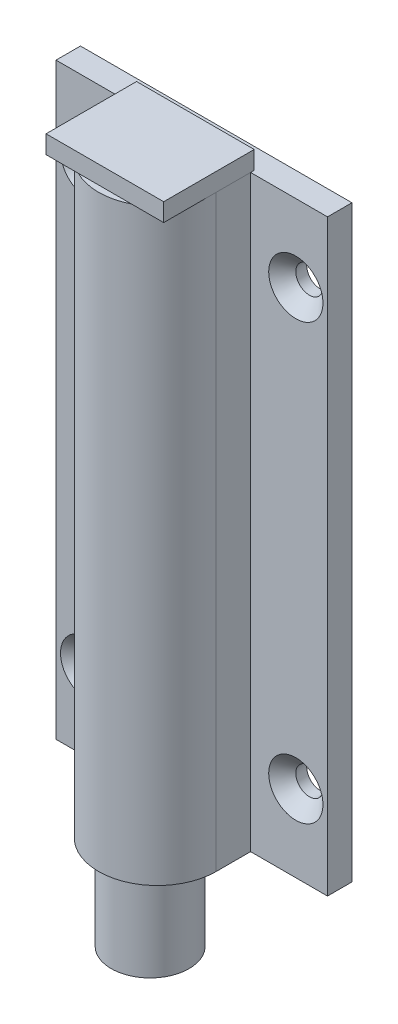
ISO-10303-21;
HEADER;
FILE_DESCRIPTION(('STEP AP214'),'2;1');
FILE_NAME('part.step','',(''),(''),'','','');
FILE_SCHEMA(('AUTOMOTIVE_DESIGN { 1 0 10303 214 1 1 1 1 }'));
ENDSEC;
DATA;
#1=APPLICATION_CONTEXT('core data for automotive mechanical design processes');
#2=APPLICATION_PROTOCOL_DEFINITION('international standard','automotive_design',2000,#1);
#3=PRODUCT_CONTEXT('',#1,'mechanical');
#4=PRODUCT('Part','Part','',(#3));
#5=PRODUCT_RELATED_PRODUCT_CATEGORY('part','',(#4));
#6=PRODUCT_DEFINITION_FORMATION('','',#4);
#7=PRODUCT_DEFINITION_CONTEXT('part definition',#1,'design');
#8=PRODUCT_DEFINITION('design','',#6,#7);
#9=PRODUCT_DEFINITION_SHAPE('','',#8);
#10=(LENGTH_UNIT() NAMED_UNIT(*) SI_UNIT(.MILLI.,.METRE.));
#11=(NAMED_UNIT(*) PLANE_ANGLE_UNIT() SI_UNIT($,.RADIAN.));
#12=(NAMED_UNIT(*) SI_UNIT($,.STERADIAN.) SOLID_ANGLE_UNIT());
#13=UNCERTAINTY_MEASURE_WITH_UNIT(LENGTH_MEASURE(1.E-05),#10,'distance_accuracy_value','');
#14=(GEOMETRIC_REPRESENTATION_CONTEXT(3) GLOBAL_UNCERTAINTY_ASSIGNED_CONTEXT((#13)) GLOBAL_UNIT_ASSIGNED_CONTEXT((#10,
#11,#12)) REPRESENTATION_CONTEXT('',''));
#15=CARTESIAN_POINT('',(0.,0.,0.));
#16=DIRECTION('',(0.,0.,1.));
#17=DIRECTION('',(1.,0.,0.));
#18=AXIS2_PLACEMENT_3D('',#15,#16,#17);
#19=CARTESIAN_POINT('',(6.5,34.5,12.3));
#20=DIRECTION('',(-1.,0.,0.));
#21=DIRECTION('',(0.,0.,1.));
#22=AXIS2_PLACEMENT_3D('',#19,#20,#21);
#23=PLANE('',#22);
#24=DIRECTION('',(0.,0.,-1.));
#25=VECTOR('',#24,1.);
#26=CARTESIAN_POINT('',(6.5,32.5,12.3));
#27=LINE('',#26,#25);
#28=CARTESIAN_POINT('',(6.5,32.5,12.3));
#29=VERTEX_POINT('',#28);
#30=CARTESIAN_POINT('',(6.5,32.5,2.3));
#31=VERTEX_POINT('',#30);
#32=EDGE_CURVE('E115',#29,#31,#27,.T.);
#33=ORIENTED_EDGE('',*,*,#32,.T.);
#34=DIRECTION('',(0.,-1.,0.));
#35=VECTOR('',#34,1.);
#36=CARTESIAN_POINT('',(6.5,34.5,2.3));
#37=LINE('',#36,#35);
#38=CARTESIAN_POINT('',(6.5,34.5,2.3));
#39=VERTEX_POINT('',#38);
#40=EDGE_CURVE('E12',#39,#31,#37,.T.);
#41=ORIENTED_EDGE('',*,*,#40,.F.);
#42=DIRECTION('',(0.,0.,-1.));
#43=VECTOR('',#42,1.);
#44=CARTESIAN_POINT('',(6.5,34.5,12.3));
#45=LINE('',#44,#43);
#46=CARTESIAN_POINT('',(6.5,34.5,12.3));
#47=VERTEX_POINT('',#46);
#48=EDGE_CURVE('E103',#47,#39,#45,.T.);
#49=ORIENTED_EDGE('',*,*,#48,.F.);
#50=DIRECTION('',(0.,-1.,0.));
#51=VECTOR('',#50,1.);
#52=CARTESIAN_POINT('',(6.5,34.5,12.3));
#53=LINE('',#52,#51);
#54=EDGE_CURVE('E111',#47,#29,#53,.T.);
#55=ORIENTED_EDGE('',*,*,#54,.T.);
#56=EDGE_LOOP('',(#33,#41,#49,#55));
#57=FACE_BOUND('',#56,.T.);
#58=ADVANCED_FACE('F52',(#57),#23,.F.);
#59=CARTESIAN_POINT('',(-6.5,34.5,2.3));
#60=DIRECTION('',(0.,0.,1.));
#61=DIRECTION('',(1.,0.,0.));
#62=AXIS2_PLACEMENT_3D('',#59,#60,#61);
#63=PLANE('',#62);
#64=DIRECTION('',(-1.,0.,0.));
#65=VECTOR('',#64,1.);
#66=CARTESIAN_POINT('',(-6.5,32.5,2.3));
#67=LINE('',#66,#65);
#68=CARTESIAN_POINT('',(-6.5,32.5,2.3));
#69=VERTEX_POINT('',#68);
#70=EDGE_CURVE('E107',#31,#69,#67,.T.);
#71=ORIENTED_EDGE('',*,*,#70,.T.);
#72=DIRECTION('',(0.,-1.,0.));
#73=VECTOR('',#72,1.);
#74=CARTESIAN_POINT('',(-6.5,34.5,2.3));
#75=LINE('',#74,#73);
#76=CARTESIAN_POINT('',(-6.5,34.5,2.3));
#77=VERTEX_POINT('',#76);
#78=EDGE_CURVE('E60',#77,#69,#75,.T.);
#79=ORIENTED_EDGE('',*,*,#78,.F.);
#80=DIRECTION('',(-1.,0.,0.));
#81=VECTOR('',#80,1.);
#82=CARTESIAN_POINT('',(-6.5,34.5,2.3));
#83=LINE('',#82,#81);
#84=EDGE_CURVE('E98',#39,#77,#83,.T.);
#85=ORIENTED_EDGE('',*,*,#84,.F.);
#86=ORIENTED_EDGE('',*,*,#40,.T.);
#87=EDGE_LOOP('',(#71,#79,#85,#86));
#88=FACE_BOUND('',#87,.T.);
#89=ADVANCED_FACE('F106',(#88),#63,.F.);
#90=CARTESIAN_POINT('',(-6.5,34.5,12.3));
#91=DIRECTION('',(1.,0.,0.));
#92=DIRECTION('',(0.,0.,-1.));
#93=AXIS2_PLACEMENT_3D('',#90,#91,#92);
#94=PLANE('',#93);
#95=DIRECTION('',(0.,0.,1.));
#96=VECTOR('',#95,1.);
#97=CARTESIAN_POINT('',(-6.5,32.5,12.3));
#98=LINE('',#97,#96);
#99=CARTESIAN_POINT('',(-6.5,32.5,12.3));
#100=VERTEX_POINT('',#99);
#101=EDGE_CURVE('E85',#69,#100,#98,.T.);
#102=ORIENTED_EDGE('',*,*,#101,.T.);
#103=DIRECTION('',(0.,-1.,0.));
#104=VECTOR('',#103,1.);
#105=CARTESIAN_POINT('',(-6.5,34.5,12.3));
#106=LINE('',#105,#104);
#107=CARTESIAN_POINT('',(-6.5,34.5,12.3));
#108=VERTEX_POINT('',#107);
#109=EDGE_CURVE('E108',#108,#100,#106,.T.);
#110=ORIENTED_EDGE('',*,*,#109,.F.);
#111=DIRECTION('',(0.,0.,1.));
#112=VECTOR('',#111,1.);
#113=CARTESIAN_POINT('',(-6.5,34.5,12.3));
#114=LINE('',#113,#112);
#115=EDGE_CURVE('E101',#77,#108,#114,.T.);
#116=ORIENTED_EDGE('',*,*,#115,.F.);
#117=ORIENTED_EDGE('',*,*,#78,.T.);
#118=EDGE_LOOP('',(#102,#110,#116,#117));
#119=FACE_BOUND('',#118,.T.);
#120=ADVANCED_FACE('F109',(#119),#94,.F.);
#121=CARTESIAN_POINT('',(-6.5,34.5,12.3));
#122=DIRECTION('',(0.,0.,-1.));
#123=DIRECTION('',(-1.,0.,0.));
#124=AXIS2_PLACEMENT_3D('',#121,#122,#123);
#125=PLANE('',#124);
#126=DIRECTION('',(1.,0.,0.));
#127=VECTOR('',#126,1.);
#128=CARTESIAN_POINT('',(-6.5,32.5,12.3));
#129=LINE('',#128,#127);
#130=EDGE_CURVE('E91',#100,#29,#129,.T.);
#131=ORIENTED_EDGE('',*,*,#130,.T.);
#132=ORIENTED_EDGE('',*,*,#54,.F.);
#133=DIRECTION('',(1.,0.,0.));
#134=VECTOR('',#133,1.);
#135=CARTESIAN_POINT('',(-6.5,34.5,12.3));
#136=LINE('',#135,#134);
#137=EDGE_CURVE('E68',#108,#47,#136,.T.);
#138=ORIENTED_EDGE('',*,*,#137,.F.);
#139=ORIENTED_EDGE('',*,*,#109,.T.);
#140=EDGE_LOOP('',(#131,#132,#138,#139));
#141=FACE_BOUND('',#140,.T.);
#142=ADVANCED_FACE('F122',(#141),#125,.F.);
#143=CARTESIAN_POINT('',(0.,34.5,0.));
#144=DIRECTION('',(0.,-1.,0.));
#145=DIRECTION('',(0.,0.,-1.));
#146=AXIS2_PLACEMENT_3D('',#143,#144,#145);
#147=PLANE('',#146);
#148=ORIENTED_EDGE('',*,*,#48,.T.);
#149=ORIENTED_EDGE('',*,*,#84,.T.);
#150=ORIENTED_EDGE('',*,*,#115,.T.);
#151=ORIENTED_EDGE('',*,*,#137,.T.);
#152=EDGE_LOOP('',(#148,#149,#150,#151));
#153=FACE_BOUND('',#152,.T.);
#154=ADVANCED_FACE('F99',(#153),#147,.F.);
#155=CARTESIAN_POINT('',(0.,32.5,0.));
#156=DIRECTION('',(0.,-1.,0.));
#157=DIRECTION('',(0.,0.,-1.));
#158=AXIS2_PLACEMENT_3D('',#155,#156,#157);
#159=PLANE('',#158);
#160=ORIENTED_EDGE('',*,*,#32,.F.);
#161=ORIENTED_EDGE('',*,*,#130,.F.);
#162=ORIENTED_EDGE('',*,*,#101,.F.);
#163=ORIENTED_EDGE('',*,*,#70,.F.);
#164=EDGE_LOOP('',(#160,#161,#162,#163));
#165=FACE_BOUND('',#164,.T.);
#166=ADVANCED_FACE('F125',(#165),#159,.T.);
#167=CLOSED_SHELL('',(#58,#89,#120,#142,#154,#166));
#168=MANIFOLD_SOLID_BREP('B2',#167);
#169=CARTESIAN_POINT('',(0.,-42.5,7.3));
#170=DIRECTION('',(0.,1.,0.));
#171=DIRECTION('',(0.,0.,1.));
#172=AXIS2_PLACEMENT_3D('',#169,#170,#171);
#173=CYLINDRICAL_SURFACE('',#172,4.3);
#174=CARTESIAN_POINT('',(0.,-42.5,7.3));
#175=DIRECTION('',(0.,-1.,0.));
#176=DIRECTION('',(0.,0.,-1.));
#177=AXIS2_PLACEMENT_3D('',#174,#175,#176);
#178=CIRCLE('',#177,4.3);
#179=CARTESIAN_POINT('',(0.,-42.5,3.));
#180=VERTEX_POINT('',#179);
#181=EDGE_CURVE('E51',#180,#180,#178,.T.);
#182=ORIENTED_EDGE('',*,*,#181,.F.);
#183=EDGE_LOOP('',(#182));
#184=FACE_BOUND('',#183,.T.);
#185=CARTESIAN_POINT('',(0.,-32.5,7.3));
#186=DIRECTION('',(0.,-1.,0.));
#187=DIRECTION('',(0.,0.,-1.));
#188=AXIS2_PLACEMENT_3D('',#185,#186,#187);
#189=CIRCLE('',#188,4.3);
#190=CARTESIAN_POINT('',(0.,-32.5,3.));
#191=VERTEX_POINT('',#190);
#192=EDGE_CURVE('E188',#191,#191,#189,.T.);
#193=ORIENTED_EDGE('',*,*,#192,.T.);
#194=EDGE_LOOP('',(#193));
#195=FACE_BOUND('',#194,.T.);
#196=ADVANCED_FACE('F185',(#184,#195),#173,.T.);
#197=CARTESIAN_POINT('',(0.,-42.5,7.3));
#198=DIRECTION('',(0.,-1.,0.));
#199=DIRECTION('',(0.,0.,-1.));
#200=AXIS2_PLACEMENT_3D('',#197,#198,#199);
#201=PLANE('',#200);
#202=ORIENTED_EDGE('',*,*,#181,.T.);
#203=EDGE_LOOP('',(#202));
#204=FACE_BOUND('',#203,.T.);
#205=ADVANCED_FACE('F200',(#204),#201,.T.);
#206=CARTESIAN_POINT('',(0.,-32.5,7.3));
#207=DIRECTION('',(0.,-1.,0.));
#208=DIRECTION('',(0.,0.,-1.));
#209=AXIS2_PLACEMENT_3D('',#206,#207,#208);
#210=PLANE('',#209);
#211=ORIENTED_EDGE('',*,*,#192,.F.);
#212=EDGE_LOOP('',(#211));
#213=FACE_BOUND('',#212,.T.);
#214=ADVANCED_FACE('F198',(#213),#210,.F.);
#215=CLOSED_SHELL('',(#196,#205,#214));
#216=MANIFOLD_SOLID_BREP('B6',#215);
#217=CARTESIAN_POINT('',(0.,0.,2.7));
#218=DIRECTION('',(0.,0.,-1.));
#219=DIRECTION('',(-1.,0.,0.));
#220=AXIS2_PLACEMENT_3D('',#217,#218,#219);
#221=PLANE('',#220);
#222=CARTESIAN_POINT('',(-11.5,24.,2.7));
#223=DIRECTION('',(0.,0.,-1.));
#224=DIRECTION('',(-1.,0.,0.));
#225=AXIS2_PLACEMENT_3D('',#222,#223,#224);
#226=CIRCLE('',#225,3.00000000000004);
#227=CARTESIAN_POINT('',(-14.5,24.,2.7));
#228=VERTEX_POINT('',#227);
#229=EDGE_CURVE('E420',#228,#228,#226,.T.);
#230=ORIENTED_EDGE('',*,*,#229,.T.);
#231=EDGE_LOOP('',(#230));
#232=FACE_BOUND('',#231,.T.);
#233=CARTESIAN_POINT('',(-11.5,-24.,2.7));
#234=DIRECTION('',(0.,0.,-1.));
#235=DIRECTION('',(-1.,0.,0.));
#236=AXIS2_PLACEMENT_3D('',#233,#234,#235);
#237=CIRCLE('',#236,3.00000000000004);
#238=CARTESIAN_POINT('',(-14.5,-24.,2.7));
#239=VERTEX_POINT('',#238);
#240=EDGE_CURVE('E416',#239,#239,#237,.T.);
#241=ORIENTED_EDGE('',*,*,#240,.T.);
#242=EDGE_LOOP('',(#241));
#243=FACE_BOUND('',#242,.T.);
#244=DIRECTION('',(0.,-1.,0.));
#245=VECTOR('',#244,1.);
#246=CARTESIAN_POINT('',(-6.5,49.0858373318925,2.7));
#247=LINE('',#246,#245);
#248=CARTESIAN_POINT('',(-6.5,32.5,2.7));
#249=VERTEX_POINT('',#248);
#250=CARTESIAN_POINT('',(-6.5,-32.5,2.7));
#251=VERTEX_POINT('',#250);
#252=EDGE_CURVE('E251',#249,#251,#247,.T.);
#253=ORIENTED_EDGE('',*,*,#252,.F.);
#254=DIRECTION('',(-1.,0.,0.));
#255=VECTOR('',#254,1.);
#256=CARTESIAN_POINT('',(-15.,32.5,2.7));
#257=LINE('',#256,#255);
#258=CARTESIAN_POINT('',(-15.,32.5,2.7));
#259=VERTEX_POINT('',#258);
#260=EDGE_CURVE('E362',#249,#259,#257,.T.);
#261=ORIENTED_EDGE('',*,*,#260,.T.);
#262=DIRECTION('',(0.,-1.,0.));
#263=VECTOR('',#262,1.);
#264=CARTESIAN_POINT('',(-15.,-32.5,2.7));
#265=LINE('',#264,#263);
#266=CARTESIAN_POINT('',(-15.,-32.5,2.7));
#267=VERTEX_POINT('',#266);
#268=EDGE_CURVE('E367',#259,#267,#265,.T.);
#269=ORIENTED_EDGE('',*,*,#268,.T.);
#270=DIRECTION('',(1.,0.,0.));
#271=VECTOR('',#270,1.);
#272=CARTESIAN_POINT('',(-15.,-32.5,2.7));
#273=LINE('',#272,#271);
#274=EDGE_CURVE('E370',#267,#251,#273,.T.);
#275=ORIENTED_EDGE('',*,*,#274,.T.);
#276=EDGE_LOOP('',(#253,#261,#269,#275));
#277=FACE_BOUND('',#276,.T.);
#278=ADVANCED_FACE('F226',(#232,#243,#277),#221,.F.);
#279=CARTESIAN_POINT('',(11.5,24.,2.7));
#280=DIRECTION('',(0.,0.,-1.));
#281=DIRECTION('',(-1.,0.,0.));
#282=AXIS2_PLACEMENT_3D('',#279,#280,#281);
#283=CIRCLE('',#282,3.00000000000002);
#284=CARTESIAN_POINT('',(8.49999999999998,24.,2.7));
#285=VERTEX_POINT('',#284);
#286=EDGE_CURVE('E408',#285,#285,#283,.T.);
#287=ORIENTED_EDGE('',*,*,#286,.T.);
#288=EDGE_LOOP('',(#287));
#289=FACE_BOUND('',#288,.T.);
#290=CARTESIAN_POINT('',(11.5,-24.,2.7));
#291=DIRECTION('',(0.,0.,-1.));
#292=DIRECTION('',(-1.,0.,0.));
#293=AXIS2_PLACEMENT_3D('',#290,#291,#292);
#294=CIRCLE('',#293,3.00000000000002);
#295=CARTESIAN_POINT('',(8.49999999999998,-24.,2.7));
#296=VERTEX_POINT('',#295);
#297=EDGE_CURVE('E404',#296,#296,#294,.T.);
#298=ORIENTED_EDGE('',*,*,#297,.T.);
#299=EDGE_LOOP('',(#298));
#300=FACE_BOUND('',#299,.T.);
#301=CARTESIAN_POINT('',(15.,32.5,2.7));
#302=VERTEX_POINT('',#301);
#303=CARTESIAN_POINT('',(6.5,32.5,2.7));
#304=VERTEX_POINT('',#303);
#305=EDGE_CURVE('E364',#302,#304,#257,.T.);
#306=ORIENTED_EDGE('',*,*,#305,.T.);
#307=DIRECTION('',(0.,-1.,0.));
#308=VECTOR('',#307,1.);
#309=CARTESIAN_POINT('',(6.5,49.0858373318925,2.7));
#310=LINE('',#309,#308);
#311=CARTESIAN_POINT('',(6.5,-32.5,2.7));
#312=VERTEX_POINT('',#311);
#313=EDGE_CURVE('E243',#304,#312,#310,.T.);
#314=ORIENTED_EDGE('',*,*,#313,.T.);
#315=CARTESIAN_POINT('',(15.,-32.5,2.7));
#316=VERTEX_POINT('',#315);
#317=EDGE_CURVE('E319',#312,#316,#273,.T.);
#318=ORIENTED_EDGE('',*,*,#317,.T.);
#319=DIRECTION('',(0.,1.,0.));
#320=VECTOR('',#319,1.);
#321=CARTESIAN_POINT('',(15.,-32.5,2.7));
#322=LINE('',#321,#320);
#323=EDGE_CURVE('E358',#316,#302,#322,.T.);
#324=ORIENTED_EDGE('',*,*,#323,.T.);
#325=EDGE_LOOP('',(#306,#314,#318,#324));
#326=FACE_BOUND('',#325,.T.);
#327=ADVANCED_FACE('F445',(#289,#300,#326),#221,.F.);
#328=CARTESIAN_POINT('',(0.,0.,0.));
#329=DIRECTION('',(0.,0.,-1.));
#330=DIRECTION('',(-1.,0.,0.));
#331=AXIS2_PLACEMENT_3D('',#328,#329,#330);
#332=PLANE('',#331);
#333=CARTESIAN_POINT('',(11.5,-24.,0.));
#334=DIRECTION('',(0.,0.,1.));
#335=DIRECTION('',(1.,0.,0.));
#336=AXIS2_PLACEMENT_3D('',#333,#334,#335);
#337=CIRCLE('',#336,1.5);
#338=CARTESIAN_POINT('',(10.,-24.,0.));
#339=VERTEX_POINT('',#338);
#340=EDGE_CURVE('E345',#339,#339,#337,.T.);
#341=ORIENTED_EDGE('',*,*,#340,.T.);
#342=EDGE_LOOP('',(#341));
#343=FACE_BOUND('',#342,.T.);
#344=CARTESIAN_POINT('',(-11.5,24.,0.));
#345=DIRECTION('',(0.,0.,1.));
#346=DIRECTION('',(1.,0.,0.));
#347=AXIS2_PLACEMENT_3D('',#344,#345,#346);
#348=CIRCLE('',#347,1.5);
#349=CARTESIAN_POINT('',(-13.,24.,0.));
#350=VERTEX_POINT('',#349);
#351=EDGE_CURVE('E353',#350,#350,#348,.T.);
#352=ORIENTED_EDGE('',*,*,#351,.T.);
#353=EDGE_LOOP('',(#352));
#354=FACE_BOUND('',#353,.T.);
#355=DIRECTION('',(0.,1.,0.));
#356=VECTOR('',#355,1.);
#357=CARTESIAN_POINT('',(15.,-32.5,0.));
#358=LINE('',#357,#356);
#359=CARTESIAN_POINT('',(15.,-32.5,0.));
#360=VERTEX_POINT('',#359);
#361=CARTESIAN_POINT('',(15.,32.5,0.));
#362=VERTEX_POINT('',#361);
#363=EDGE_CURVE('E357',#360,#362,#358,.T.);
#364=ORIENTED_EDGE('',*,*,#363,.F.);
#365=DIRECTION('',(1.,0.,0.));
#366=VECTOR('',#365,1.);
#367=CARTESIAN_POINT('',(-15.,-32.5,0.));
#368=LINE('',#367,#366);
#369=CARTESIAN_POINT('',(-15.,-32.5,0.));
#370=VERTEX_POINT('',#369);
#371=EDGE_CURVE('E363',#370,#360,#368,.T.);
#372=ORIENTED_EDGE('',*,*,#371,.F.);
#373=DIRECTION('',(0.,-1.,0.));
#374=VECTOR('',#373,1.);
#375=CARTESIAN_POINT('',(-15.,-32.5,0.));
#376=LINE('',#375,#374);
#377=CARTESIAN_POINT('',(-15.,32.5,0.));
#378=VERTEX_POINT('',#377);
#379=EDGE_CURVE('E380',#378,#370,#376,.T.);
#380=ORIENTED_EDGE('',*,*,#379,.F.);
#381=DIRECTION('',(-1.,0.,0.));
#382=VECTOR('',#381,1.);
#383=CARTESIAN_POINT('',(-15.,32.5,0.));
#384=LINE('',#383,#382);
#385=EDGE_CURVE('E377',#362,#378,#384,.T.);
#386=ORIENTED_EDGE('',*,*,#385,.F.);
#387=EDGE_LOOP('',(#364,#372,#380,#386));
#388=FACE_BOUND('',#387,.T.);
#389=CARTESIAN_POINT('',(11.5,24.,0.));
#390=DIRECTION('',(0.,0.,1.));
#391=DIRECTION('',(1.,0.,0.));
#392=AXIS2_PLACEMENT_3D('',#389,#390,#391);
#393=CIRCLE('',#392,1.5);
#394=CARTESIAN_POINT('',(10.,24.,0.));
#395=VERTEX_POINT('',#394);
#396=EDGE_CURVE('E349',#395,#395,#393,.T.);
#397=ORIENTED_EDGE('',*,*,#396,.T.);
#398=EDGE_LOOP('',(#397));
#399=FACE_BOUND('',#398,.T.);
#400=CARTESIAN_POINT('',(-11.5,-24.,0.));
#401=DIRECTION('',(0.,0.,1.));
#402=DIRECTION('',(1.,0.,0.));
#403=AXIS2_PLACEMENT_3D('',#400,#401,#402);
#404=CIRCLE('',#403,1.5);
#405=CARTESIAN_POINT('',(-13.,-24.,0.));
#406=VERTEX_POINT('',#405);
#407=EDGE_CURVE('E341',#406,#406,#404,.T.);
#408=ORIENTED_EDGE('',*,*,#407,.T.);
#409=EDGE_LOOP('',(#408));
#410=FACE_BOUND('',#409,.T.);
#411=ADVANCED_FACE('F451',(#343,#354,#388,#399,#410),#332,.T.);
#412=CARTESIAN_POINT('',(15.,-32.5,2.7));
#413=DIRECTION('',(-1.,0.,0.));
#414=DIRECTION('',(0.,0.,1.));
#415=AXIS2_PLACEMENT_3D('',#412,#413,#414);
#416=PLANE('',#415);
#417=ORIENTED_EDGE('',*,*,#363,.T.);
#418=DIRECTION('',(0.,0.,-1.));
#419=VECTOR('',#418,1.);
#420=CARTESIAN_POINT('',(15.,32.5,2.7));
#421=LINE('',#420,#419);
#422=EDGE_CURVE('E396',#302,#362,#421,.T.);
#423=ORIENTED_EDGE('',*,*,#422,.F.);
#424=ORIENTED_EDGE('',*,*,#323,.F.);
#425=DIRECTION('',(0.,0.,-1.));
#426=VECTOR('',#425,1.);
#427=CARTESIAN_POINT('',(15.,-32.5,2.7));
#428=LINE('',#427,#426);
#429=EDGE_CURVE('E373',#316,#360,#428,.T.);
#430=ORIENTED_EDGE('',*,*,#429,.T.);
#431=EDGE_LOOP('',(#417,#423,#424,#430));
#432=FACE_BOUND('',#431,.T.);
#433=ADVANCED_FACE('F460',(#432),#416,.F.);
#434=CARTESIAN_POINT('',(-15.,32.5,2.7));
#435=DIRECTION('',(0.,-1.,0.));
#436=DIRECTION('',(0.,0.,-1.));
#437=AXIS2_PLACEMENT_3D('',#434,#435,#436);
#438=PLANE('',#437);
#439=ORIENTED_EDGE('',*,*,#385,.T.);
#440=DIRECTION('',(0.,0.,-1.));
#441=VECTOR('',#440,1.);
#442=CARTESIAN_POINT('',(-15.,32.5,2.7));
#443=LINE('',#442,#441);
#444=EDGE_CURVE('E392',#259,#378,#443,.T.);
#445=ORIENTED_EDGE('',*,*,#444,.F.);
#446=ORIENTED_EDGE('',*,*,#260,.F.);
#447=DIRECTION('',(0.,0.,1.));
#448=VECTOR('',#447,1.);
#449=CARTESIAN_POINT('',(-6.5,32.5,2.7));
#450=LINE('',#449,#448);
#451=CARTESIAN_POINT('',(-6.5,32.5,6.5));
#452=VERTEX_POINT('',#451);
#453=EDGE_CURVE('E523',#249,#452,#450,.T.);
#454=ORIENTED_EDGE('',*,*,#453,.T.);
#455=CARTESIAN_POINT('',(0.,32.5,6.5));
#456=DIRECTION('',(0.,-1.,0.));
#457=DIRECTION('',(0.,0.,-1.));
#458=AXIS2_PLACEMENT_3D('',#455,#456,#457);
#459=CIRCLE('',#458,6.5);
#460=CARTESIAN_POINT('',(6.5,32.5,6.5));
#461=VERTEX_POINT('',#460);
#462=EDGE_CURVE('E332',#452,#461,#459,.F.);
#463=ORIENTED_EDGE('',*,*,#462,.T.);
#464=DIRECTION('',(0.,0.,-1.));
#465=VECTOR('',#464,1.);
#466=CARTESIAN_POINT('',(6.5,32.5,6.5));
#467=LINE('',#466,#465);
#468=EDGE_CURVE('E300',#461,#304,#467,.T.);
#469=ORIENTED_EDGE('',*,*,#468,.T.);
#470=ORIENTED_EDGE('',*,*,#305,.F.);
#471=ORIENTED_EDGE('',*,*,#422,.T.);
#472=EDGE_LOOP('',(#439,#445,#446,#454,#463,#469,#470,#471));
#473=FACE_BOUND('',#472,.T.);
#474=CARTESIAN_POINT('',(0.,32.5,7.3));
#475=DIRECTION('',(0.,-1.,0.));
#476=DIRECTION('',(0.,0.,-1.));
#477=AXIS2_PLACEMENT_3D('',#474,#475,#476);
#478=CIRCLE('',#477,4.3);
#479=CARTESIAN_POINT('',(0.,32.5,3.));
#480=VERTEX_POINT('',#479);
#481=EDGE_CURVE('E337',#480,#480,#478,.F.);
#482=ORIENTED_EDGE('',*,*,#481,.F.);
#483=EDGE_LOOP('',(#482));
#484=FACE_BOUND('',#483,.T.);
#485=ADVANCED_FACE('F467',(#473,#484),#438,.F.);
#486=CARTESIAN_POINT('',(-15.,-32.5,2.7));
#487=DIRECTION('',(1.,0.,0.));
#488=DIRECTION('',(0.,0.,-1.));
#489=AXIS2_PLACEMENT_3D('',#486,#487,#488);
#490=PLANE('',#489);
#491=ORIENTED_EDGE('',*,*,#379,.T.);
#492=DIRECTION('',(0.,0.,-1.));
#493=VECTOR('',#492,1.);
#494=CARTESIAN_POINT('',(-15.,-32.5,2.7));
#495=LINE('',#494,#493);
#496=EDGE_CURVE('E388',#267,#370,#495,.T.);
#497=ORIENTED_EDGE('',*,*,#496,.F.);
#498=ORIENTED_EDGE('',*,*,#268,.F.);
#499=ORIENTED_EDGE('',*,*,#444,.T.);
#500=EDGE_LOOP('',(#491,#497,#498,#499));
#501=FACE_BOUND('',#500,.T.);
#502=ADVANCED_FACE('F464',(#501),#490,.F.);
#503=CARTESIAN_POINT('',(-15.,-32.5,2.7));
#504=DIRECTION('',(0.,1.,0.));
#505=DIRECTION('',(0.,0.,1.));
#506=AXIS2_PLACEMENT_3D('',#503,#504,#505);
#507=PLANE('',#506);
#508=ORIENTED_EDGE('',*,*,#371,.T.);
#509=ORIENTED_EDGE('',*,*,#429,.F.);
#510=ORIENTED_EDGE('',*,*,#317,.F.);
#511=DIRECTION('',(0.,0.,1.));
#512=VECTOR('',#511,1.);
#513=CARTESIAN_POINT('',(6.5,-32.5,6.5));
#514=LINE('',#513,#512);
#515=CARTESIAN_POINT('',(6.5,-32.5,6.5));
#516=VERTEX_POINT('',#515);
#517=EDGE_CURVE('E298',#312,#516,#514,.T.);
#518=ORIENTED_EDGE('',*,*,#517,.T.);
#519=CARTESIAN_POINT('',(0.,-32.5,6.5));
#520=DIRECTION('',(0.,-1.,0.));
#521=DIRECTION('',(0.,0.,1.));
#522=AXIS2_PLACEMENT_3D('',#519,#520,#521);
#523=CIRCLE('',#522,6.5);
#524=CARTESIAN_POINT('',(-6.5,-32.5,6.5));
#525=VERTEX_POINT('',#524);
#526=EDGE_CURVE('E307',#516,#525,#523,.T.);
#527=ORIENTED_EDGE('',*,*,#526,.T.);
#528=DIRECTION('',(0.,0.,-1.));
#529=VECTOR('',#528,1.);
#530=CARTESIAN_POINT('',(-6.5,-32.5,2.7));
#531=LINE('',#530,#529);
#532=EDGE_CURVE('E314',#525,#251,#531,.T.);
#533=ORIENTED_EDGE('',*,*,#532,.T.);
#534=ORIENTED_EDGE('',*,*,#274,.F.);
#535=ORIENTED_EDGE('',*,*,#496,.T.);
#536=EDGE_LOOP('',(#508,#509,#510,#518,#527,#533,#534,#535));
#537=FACE_BOUND('',#536,.T.);
#538=CARTESIAN_POINT('',(0.,-32.5,7.3));
#539=DIRECTION('',(0.,-1.,0.));
#540=DIRECTION('',(0.,0.,-1.));
#541=AXIS2_PLACEMENT_3D('',#538,#539,#540);
#542=CIRCLE('',#541,4.3);
#543=CARTESIAN_POINT('',(0.,-32.5,3.));
#544=VERTEX_POINT('',#543);
#545=EDGE_CURVE('E321',#544,#544,#542,.T.);
#546=ORIENTED_EDGE('',*,*,#545,.F.);
#547=EDGE_LOOP('',(#546));
#548=FACE_BOUND('',#547,.T.);
#549=ADVANCED_FACE('F316',(#537,#548),#507,.F.);
#550=CARTESIAN_POINT('',(-11.5,24.,2.7));
#551=DIRECTION('',(0.,0.,-1.));
#552=DIRECTION('',(-1.,0.,0.));
#553=AXIS2_PLACEMENT_3D('',#550,#551,#552);
#554=CYLINDRICAL_SURFACE('',#553,1.5);
#555=CARTESIAN_POINT('',(-11.5,24.,1.19999999999997));
#556=DIRECTION('',(0.,0.,-1.));
#557=DIRECTION('',(-1.,0.,0.));
#558=AXIS2_PLACEMENT_3D('',#555,#556,#557);
#559=CIRCLE('',#558,1.5);
#560=CARTESIAN_POINT('',(-13.,24.,1.19999999999997));
#561=VERTEX_POINT('',#560);
#562=EDGE_CURVE('E412',#561,#561,#559,.F.);
#563=CARTESIAN_POINT('',(-13.,24.,1.19999999999997));
#564=CARTESIAN_POINT('',(-13.,24.,1.18749999999997));
#565=CARTESIAN_POINT('',(-13.,24.,1.17499999999997));
#566=CARTESIAN_POINT('',(-13.,24.,1.14999999999997));
#567=CARTESIAN_POINT('',(-13.,24.,1.13749999999997));
#568=CARTESIAN_POINT('',(-13.,24.,1.11249999999997));
#569=CARTESIAN_POINT('',(-13.,24.,1.09999999999997));
#570=CARTESIAN_POINT('',(-13.,24.,1.07499999999997));
#571=CARTESIAN_POINT('',(-13.,24.,1.06249999999997));
#572=CARTESIAN_POINT('',(-13.,24.,1.03749999999997));
#573=CARTESIAN_POINT('',(-13.,24.,1.02499999999997));
#574=CARTESIAN_POINT('',(-13.,24.,0.999999999999972));
#575=CARTESIAN_POINT('',(-13.,24.,0.987499999999972));
#576=CARTESIAN_POINT('',(-13.,24.,0.962499999999973));
#577=CARTESIAN_POINT('',(-13.,24.,0.949999999999973));
#578=CARTESIAN_POINT('',(-13.,24.,0.924999999999974));
#579=CARTESIAN_POINT('',(-13.,24.,0.912499999999974));
#580=CARTESIAN_POINT('',(-13.,24.,0.887499999999975));
#581=CARTESIAN_POINT('',(-13.,24.,0.874999999999975));
#582=CARTESIAN_POINT('',(-13.,24.,0.849999999999976));
#583=CARTESIAN_POINT('',(-13.,24.,0.837499999999976));
#584=CARTESIAN_POINT('',(-13.,24.,0.812499999999977));
#585=CARTESIAN_POINT('',(-13.,24.,0.799999999999977));
#586=CARTESIAN_POINT('',(-13.,24.,0.774999999999978));
#587=CARTESIAN_POINT('',(-13.,24.,0.762499999999978));
#588=CARTESIAN_POINT('',(-13.,24.,0.737499999999979));
#589=CARTESIAN_POINT('',(-13.,24.,0.724999999999979));
#590=CARTESIAN_POINT('',(-13.,24.,0.69999999999998));
#591=CARTESIAN_POINT('',(-13.,24.,0.68749999999998));
#592=CARTESIAN_POINT('',(-13.,24.,0.662499999999981));
#593=CARTESIAN_POINT('',(-13.,24.,0.649999999999981));
#594=CARTESIAN_POINT('',(-13.,24.,0.624999999999982));
#595=CARTESIAN_POINT('',(-13.,24.,0.612499999999983));
#596=CARTESIAN_POINT('',(-13.,24.,0.587499999999983));
#597=CARTESIAN_POINT('',(-13.,24.,0.574999999999984));
#598=CARTESIAN_POINT('',(-13.,24.,0.549999999999984));
#599=CARTESIAN_POINT('',(-13.,24.,0.537499999999985));
#600=CARTESIAN_POINT('',(-13.,24.,0.512499999999985));
#601=CARTESIAN_POINT('',(-13.,24.,0.499999999999986));
#602=CARTESIAN_POINT('',(-13.,24.,0.474999999999986));
#603=CARTESIAN_POINT('',(-13.,24.,0.462499999999987));
#604=CARTESIAN_POINT('',(-13.,24.,0.437499999999988));
#605=CARTESIAN_POINT('',(-13.,24.,0.424999999999988));
#606=CARTESIAN_POINT('',(-13.,24.,0.399999999999988));
#607=CARTESIAN_POINT('',(-13.,24.,0.387499999999989));
#608=CARTESIAN_POINT('',(-13.,24.,0.362499999999989));
#609=CARTESIAN_POINT('',(-13.,24.,0.34999999999999));
#610=CARTESIAN_POINT('',(-13.,24.,0.324999999999991));
#611=CARTESIAN_POINT('',(-13.,24.,0.312499999999991));
#612=CARTESIAN_POINT('',(-13.,24.,0.287499999999992));
#613=CARTESIAN_POINT('',(-13.,24.,0.274999999999992));
#614=CARTESIAN_POINT('',(-13.,24.,0.249999999999993));
#615=CARTESIAN_POINT('',(-13.,24.,0.237499999999993));
#616=CARTESIAN_POINT('',(-13.,24.,0.212499999999994));
#617=CARTESIAN_POINT('',(-13.,24.,0.199999999999994));
#618=CARTESIAN_POINT('',(-13.,24.,0.174999999999995));
#619=CARTESIAN_POINT('',(-13.,24.,0.162499999999995));
#620=CARTESIAN_POINT('',(-13.,24.,0.137499999999996));
#621=CARTESIAN_POINT('',(-13.,24.,0.124999999999996));
#622=CARTESIAN_POINT('',(-13.,24.,0.0999999999999969));
#623=CARTESIAN_POINT('',(-13.,24.,0.0874999999999971));
#624=CARTESIAN_POINT('',(-13.,24.,0.0624999999999977));
#625=CARTESIAN_POINT('',(-13.,24.,0.0499999999999981));
#626=CARTESIAN_POINT('',(-13.,24.,0.0249999999999988));
#627=CARTESIAN_POINT('',(-13.,24.,0.0124999999999992));
#628=CARTESIAN_POINT('',(-13.,24.,0.));
#629=B_SPLINE_CURVE_WITH_KNOTS('',3,(#563,#564,#565,#566,#567,#568,#569,#570,#571,#572,#573,
#574,#575,#576,#577,#578,#579,#580,#581,#582,#583,#584,#585,#586,#587,#588,#589,#590,#591,#592,
#593,#594,#595,#596,#597,#598,#599,#600,#601,#602,#603,#604,#605,#606,#607,#608,#609,#610,#611,
#612,#613,#614,#615,#616,#617,#618,#619,#620,#621,#622,#623,#624,#625,#626,#627,#628),
.UNSPECIFIED.,.F.,.F.,(4,2,2,2,2,2,2,2,2,2,2,2,2,2,2,2,2,2,2,2,2,2,2,2,2,2,2,2,2,2,2,2,4),(0.,
0.0374999999999989,0.0749999999999978,0.112499999999997,0.149999999999996,0.187499999999995,
0.224999999999994,0.262499999999993,0.299999999999992,0.337499999999991,0.37499999999999,
0.412499999999989,0.449999999999988,0.487499999999986,0.524999999999985,0.562499999999984,
0.599999999999983,0.637499999999982,0.674999999999981,0.71249999999998,0.749999999999979,
0.787499999999978,0.824999999999977,0.862499999999976,0.899999999999975,0.937499999999974,
0.974999999999973,1.01249999999997,1.04999999999997,1.08749999999997,1.12499999999997,
1.16249999999997,1.19999999999997),.UNSPECIFIED.);
#630=EDGE_CURVE('BSEAM456',#561,#350,#629,.T.);
#631=ORIENTED_EDGE('',*,*,#562,.T.);
#632=ORIENTED_EDGE('',*,*,#351,.F.);
#633=ORIENTED_EDGE('',*,*,#630,.T.);
#634=ORIENTED_EDGE('',*,*,#630,.F.);
#635=EDGE_LOOP('',(#631,#633,#632,#634));
#636=FACE_BOUND('',#635,.T.);
#637=ADVANCED_FACE('F456',(#636),#554,.F.);
#638=CARTESIAN_POINT('',(11.5,24.,2.7));
#639=DIRECTION('',(0.,0.,-1.));
#640=DIRECTION('',(-1.,0.,0.));
#641=AXIS2_PLACEMENT_3D('',#638,#639,#640);
#642=CYLINDRICAL_SURFACE('',#641,1.5);
#643=CARTESIAN_POINT('',(11.5,24.,1.19999999999999));
#644=DIRECTION('',(0.,0.,-1.));
#645=DIRECTION('',(-1.,0.,0.));
#646=AXIS2_PLACEMENT_3D('',#643,#644,#645);
#647=CIRCLE('',#646,1.5);
#648=CARTESIAN_POINT('',(10.,24.,1.19999999999999));
#649=VERTEX_POINT('',#648);
#650=EDGE_CURVE('E400',#649,#649,#647,.F.);
#651=CARTESIAN_POINT('',(10.,24.,1.19999999999999));
#652=CARTESIAN_POINT('',(10.,24.,1.18749999999999));
#653=CARTESIAN_POINT('',(10.,24.,1.17499999999999));
#654=CARTESIAN_POINT('',(10.,24.,1.14999999999999));
#655=CARTESIAN_POINT('',(10.,24.,1.13749999999999));
#656=CARTESIAN_POINT('',(10.,24.,1.11249999999999));
#657=CARTESIAN_POINT('',(10.,24.,1.09999999999999));
#658=CARTESIAN_POINT('',(10.,24.,1.07499999999999));
#659=CARTESIAN_POINT('',(10.,24.,1.06249999999999));
#660=CARTESIAN_POINT('',(10.,24.,1.03749999999999));
#661=CARTESIAN_POINT('',(10.,24.,1.02499999999999));
#662=CARTESIAN_POINT('',(10.,24.,0.999999999999989));
#663=CARTESIAN_POINT('',(10.,24.,0.987499999999989));
#664=CARTESIAN_POINT('',(10.,24.,0.962499999999989));
#665=CARTESIAN_POINT('',(10.,24.,0.949999999999989));
#666=CARTESIAN_POINT('',(10.,24.,0.92499999999999));
#667=CARTESIAN_POINT('',(10.,24.,0.91249999999999));
#668=CARTESIAN_POINT('',(10.,24.,0.88749999999999));
#669=CARTESIAN_POINT('',(10.,24.,0.87499999999999));
#670=CARTESIAN_POINT('',(10.,24.,0.849999999999991));
#671=CARTESIAN_POINT('',(10.,24.,0.837499999999991));
#672=CARTESIAN_POINT('',(10.,24.,0.812499999999991));
#673=CARTESIAN_POINT('',(10.,24.,0.799999999999991));
#674=CARTESIAN_POINT('',(10.,24.,0.774999999999991));
#675=CARTESIAN_POINT('',(10.,24.,0.762499999999991));
#676=CARTESIAN_POINT('',(10.,24.,0.737499999999992));
#677=CARTESIAN_POINT('',(10.,24.,0.724999999999992));
#678=CARTESIAN_POINT('',(10.,24.,0.699999999999992));
#679=CARTESIAN_POINT('',(10.,24.,0.687499999999992));
#680=CARTESIAN_POINT('',(10.,24.,0.662499999999993));
#681=CARTESIAN_POINT('',(10.,24.,0.649999999999993));
#682=CARTESIAN_POINT('',(10.,24.,0.624999999999993));
#683=CARTESIAN_POINT('',(10.,24.,0.612499999999993));
#684=CARTESIAN_POINT('',(10.,24.,0.587499999999993));
#685=CARTESIAN_POINT('',(10.,24.,0.574999999999994));
#686=CARTESIAN_POINT('',(10.,24.,0.549999999999994));
#687=CARTESIAN_POINT('',(10.,24.,0.537499999999994));
#688=CARTESIAN_POINT('',(10.,24.,0.512499999999994));
#689=CARTESIAN_POINT('',(10.,24.,0.499999999999994));
#690=CARTESIAN_POINT('',(10.,24.,0.474999999999995));
#691=CARTESIAN_POINT('',(10.,24.,0.462499999999995));
#692=CARTESIAN_POINT('',(10.,24.,0.437499999999995));
#693=CARTESIAN_POINT('',(10.,24.,0.424999999999995));
#694=CARTESIAN_POINT('',(10.,24.,0.399999999999995));
#695=CARTESIAN_POINT('',(10.,24.,0.387499999999996));
#696=CARTESIAN_POINT('',(10.,24.,0.362499999999996));
#697=CARTESIAN_POINT('',(10.,24.,0.349999999999996));
#698=CARTESIAN_POINT('',(10.,24.,0.324999999999996));
#699=CARTESIAN_POINT('',(10.,24.,0.312499999999996));
#700=CARTESIAN_POINT('',(10.,24.,0.287499999999997));
#701=CARTESIAN_POINT('',(10.,24.,0.274999999999997));
#702=CARTESIAN_POINT('',(10.,24.,0.249999999999997));
#703=CARTESIAN_POINT('',(10.,24.,0.237499999999997));
#704=CARTESIAN_POINT('',(10.,24.,0.212499999999997));
#705=CARTESIAN_POINT('',(10.,24.,0.199999999999997));
#706=CARTESIAN_POINT('',(10.,24.,0.174999999999998));
#707=CARTESIAN_POINT('',(10.,24.,0.162499999999998));
#708=CARTESIAN_POINT('',(10.,24.,0.137499999999998));
#709=CARTESIAN_POINT('',(10.,24.,0.124999999999998));
#710=CARTESIAN_POINT('',(10.,24.,0.0999999999999985));
#711=CARTESIAN_POINT('',(10.,24.,0.0874999999999986));
#712=CARTESIAN_POINT('',(10.,24.,0.0624999999999988));
#713=CARTESIAN_POINT('',(10.,24.,0.0499999999999988));
#714=CARTESIAN_POINT('',(10.,24.,0.0249999999999991));
#715=CARTESIAN_POINT('',(10.,24.,0.0124999999999994));
#716=CARTESIAN_POINT('',(10.,24.,0.));
#717=B_SPLINE_CURVE_WITH_KNOTS('',3,(#651,#652,#653,#654,#655,#656,#657,#658,#659,#660,#661,
#662,#663,#664,#665,#666,#667,#668,#669,#670,#671,#672,#673,#674,#675,#676,#677,#678,#679,#680,
#681,#682,#683,#684,#685,#686,#687,#688,#689,#690,#691,#692,#693,#694,#695,#696,#697,#698,#699,
#700,#701,#702,#703,#704,#705,#706,#707,#708,#709,#710,#711,#712,#713,#714,#715,#716),
.UNSPECIFIED.,.F.,.F.,(4,2,2,2,2,2,2,2,2,2,2,2,2,2,2,2,2,2,2,2,2,2,2,2,2,2,2,2,2,2,2,2,4),(0.,
0.0374999999999996,0.0749999999999991,0.112499999999999,0.149999999999998,0.187499999999998,
0.224999999999998,0.262499999999997,0.299999999999997,0.337499999999996,0.374999999999996,
0.412499999999996,0.449999999999995,0.487499999999995,0.524999999999994,0.562499999999994,
0.599999999999994,0.637499999999993,0.674999999999993,0.712499999999992,0.749999999999992,
0.787499999999992,0.824999999999991,0.862499999999991,0.89999999999999,0.93749999999999,
0.97499999999999,1.01249999999999,1.04999999999999,1.08749999999999,1.12499999999999,
1.16249999999999,1.19999999999999),.UNSPECIFIED.);
#718=EDGE_CURVE('BSEAM498',#649,#395,#717,.T.);
#719=ORIENTED_EDGE('',*,*,#650,.T.);
#720=ORIENTED_EDGE('',*,*,#396,.F.);
#721=ORIENTED_EDGE('',*,*,#718,.T.);
#722=ORIENTED_EDGE('',*,*,#718,.F.);
#723=EDGE_LOOP('',(#719,#721,#720,#722));
#724=FACE_BOUND('',#723,.T.);
#725=ADVANCED_FACE('F498',(#724),#642,.F.);
#726=CARTESIAN_POINT('',(11.5,-24.,2.7));
#727=DIRECTION('',(0.,0.,-1.));
#728=DIRECTION('',(-1.,0.,0.));
#729=AXIS2_PLACEMENT_3D('',#726,#727,#728);
#730=CYLINDRICAL_SURFACE('',#729,1.5);
#731=CARTESIAN_POINT('',(11.5,-24.,1.19999999999999));
#732=DIRECTION('',(0.,0.,-1.));
#733=DIRECTION('',(-1.,0.,0.));
#734=AXIS2_PLACEMENT_3D('',#731,#732,#733);
#735=CIRCLE('',#734,1.5);
#736=CARTESIAN_POINT('',(10.,-24.,1.19999999999999));
#737=VERTEX_POINT('',#736);
#738=EDGE_CURVE('E183',#737,#737,#735,.F.);
#739=CARTESIAN_POINT('',(10.,-24.,1.19999999999999));
#740=CARTESIAN_POINT('',(10.,-24.,1.18749999999999));
#741=CARTESIAN_POINT('',(10.,-24.,1.17499999999999));
#742=CARTESIAN_POINT('',(10.,-24.,1.14999999999999));
#743=CARTESIAN_POINT('',(10.,-24.,1.13749999999999));
#744=CARTESIAN_POINT('',(10.,-24.,1.11249999999999));
#745=CARTESIAN_POINT('',(10.,-24.,1.09999999999999));
#746=CARTESIAN_POINT('',(10.,-24.,1.07499999999999));
#747=CARTESIAN_POINT('',(10.,-24.,1.06249999999999));
#748=CARTESIAN_POINT('',(10.,-24.,1.03749999999999));
#749=CARTESIAN_POINT('',(10.,-24.,1.02499999999999));
#750=CARTESIAN_POINT('',(10.,-24.,0.999999999999989));
#751=CARTESIAN_POINT('',(10.,-24.,0.987499999999989));
#752=CARTESIAN_POINT('',(10.,-24.,0.962499999999989));
#753=CARTESIAN_POINT('',(10.,-24.,0.949999999999989));
#754=CARTESIAN_POINT('',(10.,-24.,0.92499999999999));
#755=CARTESIAN_POINT('',(10.,-24.,0.91249999999999));
#756=CARTESIAN_POINT('',(10.,-24.,0.88749999999999));
#757=CARTESIAN_POINT('',(10.,-24.,0.87499999999999));
#758=CARTESIAN_POINT('',(10.,-24.,0.849999999999991));
#759=CARTESIAN_POINT('',(10.,-24.,0.837499999999991));
#760=CARTESIAN_POINT('',(10.,-24.,0.812499999999991));
#761=CARTESIAN_POINT('',(10.,-24.,0.799999999999991));
#762=CARTESIAN_POINT('',(10.,-24.,0.774999999999991));
#763=CARTESIAN_POINT('',(10.,-24.,0.762499999999991));
#764=CARTESIAN_POINT('',(10.,-24.,0.737499999999992));
#765=CARTESIAN_POINT('',(10.,-24.,0.724999999999992));
#766=CARTESIAN_POINT('',(10.,-24.,0.699999999999992));
#767=CARTESIAN_POINT('',(10.,-24.,0.687499999999992));
#768=CARTESIAN_POINT('',(10.,-24.,0.662499999999993));
#769=CARTESIAN_POINT('',(10.,-24.,0.649999999999993));
#770=CARTESIAN_POINT('',(10.,-24.,0.624999999999993));
#771=CARTESIAN_POINT('',(10.,-24.,0.612499999999993));
#772=CARTESIAN_POINT('',(10.,-24.,0.587499999999993));
#773=CARTESIAN_POINT('',(10.,-24.,0.574999999999994));
#774=CARTESIAN_POINT('',(10.,-24.,0.549999999999994));
#775=CARTESIAN_POINT('',(10.,-24.,0.537499999999994));
#776=CARTESIAN_POINT('',(10.,-24.,0.512499999999994));
#777=CARTESIAN_POINT('',(10.,-24.,0.499999999999994));
#778=CARTESIAN_POINT('',(10.,-24.,0.474999999999995));
#779=CARTESIAN_POINT('',(10.,-24.,0.462499999999995));
#780=CARTESIAN_POINT('',(10.,-24.,0.437499999999995));
#781=CARTESIAN_POINT('',(10.,-24.,0.424999999999995));
#782=CARTESIAN_POINT('',(10.,-24.,0.399999999999995));
#783=CARTESIAN_POINT('',(10.,-24.,0.387499999999996));
#784=CARTESIAN_POINT('',(10.,-24.,0.362499999999996));
#785=CARTESIAN_POINT('',(10.,-24.,0.349999999999996));
#786=CARTESIAN_POINT('',(10.,-24.,0.324999999999996));
#787=CARTESIAN_POINT('',(10.,-24.,0.312499999999996));
#788=CARTESIAN_POINT('',(10.,-24.,0.287499999999997));
#789=CARTESIAN_POINT('',(10.,-24.,0.274999999999997));
#790=CARTESIAN_POINT('',(10.,-24.,0.249999999999997));
#791=CARTESIAN_POINT('',(10.,-24.,0.237499999999997));
#792=CARTESIAN_POINT('',(10.,-24.,0.212499999999997));
#793=CARTESIAN_POINT('',(10.,-24.,0.199999999999997));
#794=CARTESIAN_POINT('',(10.,-24.,0.174999999999998));
#795=CARTESIAN_POINT('',(10.,-24.,0.162499999999998));
#796=CARTESIAN_POINT('',(10.,-24.,0.137499999999998));
#797=CARTESIAN_POINT('',(10.,-24.,0.124999999999998));
#798=CARTESIAN_POINT('',(10.,-24.,0.0999999999999985));
#799=CARTESIAN_POINT('',(10.,-24.,0.0874999999999986));
#800=CARTESIAN_POINT('',(10.,-24.,0.0624999999999988));
#801=CARTESIAN_POINT('',(10.,-24.,0.0499999999999988));
#802=CARTESIAN_POINT('',(10.,-24.,0.0249999999999991));
#803=CARTESIAN_POINT('',(10.,-24.,0.0124999999999994));
#804=CARTESIAN_POINT('',(10.,-24.,0.));
#805=B_SPLINE_CURVE_WITH_KNOTS('',3,(#739,#740,#741,#742,#743,#744,#745,#746,#747,#748,#749,
#750,#751,#752,#753,#754,#755,#756,#757,#758,#759,#760,#761,#762,#763,#764,#765,#766,#767,#768,
#769,#770,#771,#772,#773,#774,#775,#776,#777,#778,#779,#780,#781,#782,#783,#784,#785,#786,#787,
#788,#789,#790,#791,#792,#793,#794,#795,#796,#797,#798,#799,#800,#801,#802,#803,#804),
.UNSPECIFIED.,.F.,.F.,(4,2,2,2,2,2,2,2,2,2,2,2,2,2,2,2,2,2,2,2,2,2,2,2,2,2,2,2,2,2,2,2,4),(0.,
0.0374999999999996,0.0749999999999991,0.112499999999999,0.149999999999998,0.187499999999998,
0.224999999999998,0.262499999999997,0.299999999999997,0.337499999999996,0.374999999999996,
0.412499999999996,0.449999999999995,0.487499999999995,0.524999999999994,0.562499999999994,
0.599999999999994,0.637499999999993,0.674999999999993,0.712499999999992,0.749999999999992,
0.787499999999992,0.824999999999991,0.862499999999991,0.89999999999999,0.93749999999999,
0.97499999999999,1.01249999999999,1.04999999999999,1.08749999999999,1.12499999999999,
1.16249999999999,1.19999999999999),.UNSPECIFIED.);
#806=EDGE_CURVE('BSEAM501',#737,#339,#805,.T.);
#807=ORIENTED_EDGE('',*,*,#738,.T.);
#808=ORIENTED_EDGE('',*,*,#340,.F.);
#809=ORIENTED_EDGE('',*,*,#806,.T.);
#810=ORIENTED_EDGE('',*,*,#806,.F.);
#811=EDGE_LOOP('',(#807,#809,#808,#810));
#812=FACE_BOUND('',#811,.T.);
#813=ADVANCED_FACE('F501',(#812),#730,.F.);
#814=CARTESIAN_POINT('',(-11.5,-24.,2.7));
#815=DIRECTION('',(0.,0.,-1.));
#816=DIRECTION('',(-1.,0.,0.));
#817=AXIS2_PLACEMENT_3D('',#814,#815,#816);
#818=CYLINDRICAL_SURFACE('',#817,1.5);
#819=CARTESIAN_POINT('',(-11.5,-24.,1.19999999999997));
#820=DIRECTION('',(0.,0.,-1.));
#821=DIRECTION('',(-1.,0.,0.));
#822=AXIS2_PLACEMENT_3D('',#819,#820,#821);
#823=CIRCLE('',#822,1.5);
#824=CARTESIAN_POINT('',(-13.,-24.,1.19999999999997));
#825=VERTEX_POINT('',#824);
#826=EDGE_CURVE('E236',#825,#825,#823,.F.);
#827=CARTESIAN_POINT('',(-13.,-24.,1.19999999999997));
#828=CARTESIAN_POINT('',(-13.,-24.,1.18749999999997));
#829=CARTESIAN_POINT('',(-13.,-24.,1.17499999999997));
#830=CARTESIAN_POINT('',(-13.,-24.,1.14999999999997));
#831=CARTESIAN_POINT('',(-13.,-24.,1.13749999999997));
#832=CARTESIAN_POINT('',(-13.,-24.,1.11249999999997));
#833=CARTESIAN_POINT('',(-13.,-24.,1.09999999999997));
#834=CARTESIAN_POINT('',(-13.,-24.,1.07499999999997));
#835=CARTESIAN_POINT('',(-13.,-24.,1.06249999999997));
#836=CARTESIAN_POINT('',(-13.,-24.,1.03749999999997));
#837=CARTESIAN_POINT('',(-13.,-24.,1.02499999999997));
#838=CARTESIAN_POINT('',(-13.,-24.,0.999999999999972));
#839=CARTESIAN_POINT('',(-13.,-24.,0.987499999999972));
#840=CARTESIAN_POINT('',(-13.,-24.,0.962499999999973));
#841=CARTESIAN_POINT('',(-13.,-24.,0.949999999999973));
#842=CARTESIAN_POINT('',(-13.,-24.,0.924999999999974));
#843=CARTESIAN_POINT('',(-13.,-24.,0.912499999999974));
#844=CARTESIAN_POINT('',(-13.,-24.,0.887499999999975));
#845=CARTESIAN_POINT('',(-13.,-24.,0.874999999999975));
#846=CARTESIAN_POINT('',(-13.,-24.,0.849999999999976));
#847=CARTESIAN_POINT('',(-13.,-24.,0.837499999999976));
#848=CARTESIAN_POINT('',(-13.,-24.,0.812499999999977));
#849=CARTESIAN_POINT('',(-13.,-24.,0.799999999999977));
#850=CARTESIAN_POINT('',(-13.,-24.,0.774999999999978));
#851=CARTESIAN_POINT('',(-13.,-24.,0.762499999999978));
#852=CARTESIAN_POINT('',(-13.,-24.,0.737499999999979));
#853=CARTESIAN_POINT('',(-13.,-24.,0.724999999999979));
#854=CARTESIAN_POINT('',(-13.,-24.,0.69999999999998));
#855=CARTESIAN_POINT('',(-13.,-24.,0.68749999999998));
#856=CARTESIAN_POINT('',(-13.,-24.,0.662499999999981));
#857=CARTESIAN_POINT('',(-13.,-24.,0.649999999999981));
#858=CARTESIAN_POINT('',(-13.,-24.,0.624999999999982));
#859=CARTESIAN_POINT('',(-13.,-24.,0.612499999999983));
#860=CARTESIAN_POINT('',(-13.,-24.,0.587499999999983));
#861=CARTESIAN_POINT('',(-13.,-24.,0.574999999999984));
#862=CARTESIAN_POINT('',(-13.,-24.,0.549999999999984));
#863=CARTESIAN_POINT('',(-13.,-24.,0.537499999999985));
#864=CARTESIAN_POINT('',(-13.,-24.,0.512499999999985));
#865=CARTESIAN_POINT('',(-13.,-24.,0.499999999999986));
#866=CARTESIAN_POINT('',(-13.,-24.,0.474999999999986));
#867=CARTESIAN_POINT('',(-13.,-24.,0.462499999999987));
#868=CARTESIAN_POINT('',(-13.,-24.,0.437499999999988));
#869=CARTESIAN_POINT('',(-13.,-24.,0.424999999999988));
#870=CARTESIAN_POINT('',(-13.,-24.,0.399999999999988));
#871=CARTESIAN_POINT('',(-13.,-24.,0.387499999999989));
#872=CARTESIAN_POINT('',(-13.,-24.,0.362499999999989));
#873=CARTESIAN_POINT('',(-13.,-24.,0.34999999999999));
#874=CARTESIAN_POINT('',(-13.,-24.,0.324999999999991));
#875=CARTESIAN_POINT('',(-13.,-24.,0.312499999999991));
#876=CARTESIAN_POINT('',(-13.,-24.,0.287499999999992));
#877=CARTESIAN_POINT('',(-13.,-24.,0.274999999999992));
#878=CARTESIAN_POINT('',(-13.,-24.,0.249999999999993));
#879=CARTESIAN_POINT('',(-13.,-24.,0.237499999999993));
#880=CARTESIAN_POINT('',(-13.,-24.,0.212499999999994));
#881=CARTESIAN_POINT('',(-13.,-24.,0.199999999999994));
#882=CARTESIAN_POINT('',(-13.,-24.,0.174999999999995));
#883=CARTESIAN_POINT('',(-13.,-24.,0.162499999999995));
#884=CARTESIAN_POINT('',(-13.,-24.,0.137499999999996));
#885=CARTESIAN_POINT('',(-13.,-24.,0.124999999999996));
#886=CARTESIAN_POINT('',(-13.,-24.,0.0999999999999969));
#887=CARTESIAN_POINT('',(-13.,-24.,0.0874999999999971));
#888=CARTESIAN_POINT('',(-13.,-24.,0.0624999999999977));
#889=CARTESIAN_POINT('',(-13.,-24.,0.0499999999999981));
#890=CARTESIAN_POINT('',(-13.,-24.,0.0249999999999988));
#891=CARTESIAN_POINT('',(-13.,-24.,0.0124999999999992));
#892=CARTESIAN_POINT('',(-13.,-24.,0.));
#893=B_SPLINE_CURVE_WITH_KNOTS('',3,(#827,#828,#829,#830,#831,#832,#833,#834,#835,#836,#837,
#838,#839,#840,#841,#842,#843,#844,#845,#846,#847,#848,#849,#850,#851,#852,#853,#854,#855,#856,
#857,#858,#859,#860,#861,#862,#863,#864,#865,#866,#867,#868,#869,#870,#871,#872,#873,#874,#875,
#876,#877,#878,#879,#880,#881,#882,#883,#884,#885,#886,#887,#888,#889,#890,#891,#892),
.UNSPECIFIED.,.F.,.F.,(4,2,2,2,2,2,2,2,2,2,2,2,2,2,2,2,2,2,2,2,2,2,2,2,2,2,2,2,2,2,2,2,4),(0.,
0.0374999999999989,0.0749999999999978,0.112499999999997,0.149999999999996,0.187499999999995,
0.224999999999994,0.262499999999993,0.299999999999992,0.337499999999991,0.37499999999999,
0.412499999999989,0.449999999999988,0.487499999999986,0.524999999999985,0.562499999999984,
0.599999999999983,0.637499999999982,0.674999999999981,0.71249999999998,0.749999999999979,
0.787499999999978,0.824999999999977,0.862499999999976,0.899999999999975,0.937499999999974,
0.974999999999973,1.01249999999997,1.04999999999997,1.08749999999997,1.12499999999997,
1.16249999999997,1.19999999999997),.UNSPECIFIED.);
#894=EDGE_CURVE('BSEAM427',#825,#406,#893,.T.);
#895=ORIENTED_EDGE('',*,*,#826,.T.);
#896=ORIENTED_EDGE('',*,*,#407,.F.);
#897=ORIENTED_EDGE('',*,*,#894,.T.);
#898=ORIENTED_EDGE('',*,*,#894,.F.);
#899=EDGE_LOOP('',(#895,#897,#896,#898));
#900=FACE_BOUND('',#899,.T.);
#901=ADVANCED_FACE('F427',(#900),#818,.F.);
#902=CARTESIAN_POINT('',(6.5,49.0858373318925,6.5));
#903=DIRECTION('',(1.,0.,0.));
#904=DIRECTION('',(0.,0.,-1.));
#905=AXIS2_PLACEMENT_3D('',#902,#903,#904);
#906=PLANE('',#905);
#907=ORIENTED_EDGE('',*,*,#468,.F.);
#908=DIRECTION('',(0.,-1.,0.));
#909=VECTOR('',#908,1.);
#910=CARTESIAN_POINT('',(6.5,49.0858373318925,6.5));
#911=LINE('',#910,#909);
#912=EDGE_CURVE('E294',#461,#516,#911,.T.);
#913=ORIENTED_EDGE('',*,*,#912,.T.);
#914=ORIENTED_EDGE('',*,*,#517,.F.);
#915=ORIENTED_EDGE('',*,*,#313,.F.);
#916=EDGE_LOOP('',(#907,#913,#914,#915));
#917=FACE_BOUND('',#916,.T.);
#918=ADVANCED_FACE('F296',(#917),#906,.T.);
#919=CARTESIAN_POINT('',(0.,49.0858373318925,6.5));
#920=DIRECTION('',(0.,-1.,0.));
#921=DIRECTION('',(0.,0.,-1.));
#922=AXIS2_PLACEMENT_3D('',#919,#920,#921);
#923=CYLINDRICAL_SURFACE('',#922,6.5);
#924=ORIENTED_EDGE('',*,*,#462,.F.);
#925=DIRECTION('',(0.,-1.,0.));
#926=VECTOR('',#925,1.);
#927=CARTESIAN_POINT('',(-6.5,49.0858373318925,6.5));
#928=LINE('',#927,#926);
#929=EDGE_CURVE('E304',#452,#525,#928,.T.);
#930=ORIENTED_EDGE('',*,*,#929,.T.);
#931=ORIENTED_EDGE('',*,*,#526,.F.);
#932=ORIENTED_EDGE('',*,*,#912,.F.);
#933=EDGE_LOOP('',(#924,#930,#931,#932));
#934=FACE_BOUND('',#933,.T.);
#935=ADVANCED_FACE('F308',(#934),#923,.T.);
#936=CARTESIAN_POINT('',(-6.5,49.0858373318925,2.7));
#937=DIRECTION('',(-1.,0.,0.));
#938=DIRECTION('',(0.,0.,1.));
#939=AXIS2_PLACEMENT_3D('',#936,#937,#938);
#940=PLANE('',#939);
#941=ORIENTED_EDGE('',*,*,#453,.F.);
#942=ORIENTED_EDGE('',*,*,#252,.T.);
#943=ORIENTED_EDGE('',*,*,#532,.F.);
#944=ORIENTED_EDGE('',*,*,#929,.F.);
#945=EDGE_LOOP('',(#941,#942,#943,#944));
#946=FACE_BOUND('',#945,.T.);
#947=ADVANCED_FACE('F491',(#946),#940,.T.);
#948=CARTESIAN_POINT('',(0.,49.0858373318925,7.3));
#949=DIRECTION('',(0.,-1.,0.));
#950=DIRECTION('',(0.,0.,-1.));
#951=AXIS2_PLACEMENT_3D('',#948,#949,#950);
#952=CYLINDRICAL_SURFACE('',#951,4.3);
#953=ORIENTED_EDGE('',*,*,#481,.T.);
#954=EDGE_LOOP('',(#953));
#955=FACE_BOUND('',#954,.T.);
#956=ORIENTED_EDGE('',*,*,#545,.T.);
#957=EDGE_LOOP('',(#956));
#958=FACE_BOUND('',#957,.T.);
#959=ADVANCED_FACE('F480',(#955,#958),#952,.F.);
#960=CARTESIAN_POINT('',(11.5,24.,1.19999999999999));
#961=DIRECTION('',(0.,0.,1.));
#962=DIRECTION('',(1.,0.,0.));
#963=AXIS2_PLACEMENT_3D('',#960,#961,#962);
#964=CONICAL_SURFACE('',#963,1.5,0.785398163397451);
#965=ORIENTED_EDGE('',*,*,#286,.F.);
#966=EDGE_LOOP('',(#965));
#967=FACE_BOUND('',#966,.T.);
#968=ORIENTED_EDGE('',*,*,#650,.F.);
#969=EDGE_LOOP('',(#968));
#970=FACE_BOUND('',#969,.T.);
#971=ADVANCED_FACE('F439',(#967,#970),#964,.F.);
#972=CARTESIAN_POINT('',(-11.5,24.,1.19999999999997));
#973=DIRECTION('',(0.,0.,1.));
#974=DIRECTION('',(1.,0.,0.));
#975=AXIS2_PLACEMENT_3D('',#972,#973,#974);
#976=CONICAL_SURFACE('',#975,1.5,0.785398163397451);
#977=ORIENTED_EDGE('',*,*,#229,.F.);
#978=EDGE_LOOP('',(#977));
#979=FACE_BOUND('',#978,.T.);
#980=ORIENTED_EDGE('',*,*,#562,.F.);
#981=EDGE_LOOP('',(#980));
#982=FACE_BOUND('',#981,.T.);
#983=ADVANCED_FACE('F432',(#979,#982),#976,.F.);
#984=CARTESIAN_POINT('',(-11.5,-24.,1.19999999999997));
#985=DIRECTION('',(0.,0.,1.));
#986=DIRECTION('',(1.,0.,0.));
#987=AXIS2_PLACEMENT_3D('',#984,#985,#986);
#988=CONICAL_SURFACE('',#987,1.5,0.785398163397451);
#989=ORIENTED_EDGE('',*,*,#240,.F.);
#990=EDGE_LOOP('',(#989));
#991=FACE_BOUND('',#990,.T.);
#992=ORIENTED_EDGE('',*,*,#826,.F.);
#993=EDGE_LOOP('',(#992));
#994=FACE_BOUND('',#993,.T.);
#995=ADVANCED_FACE('F430',(#991,#994),#988,.F.);
#996=CARTESIAN_POINT('',(11.5,-24.,1.19999999999999));
#997=DIRECTION('',(0.,0.,1.));
#998=DIRECTION('',(1.,0.,0.));
#999=AXIS2_PLACEMENT_3D('',#996,#997,#998);
#1000=CONICAL_SURFACE('',#999,1.5,0.785398163397451);
#1001=ORIENTED_EDGE('',*,*,#297,.F.);
#1002=EDGE_LOOP('',(#1001));
#1003=FACE_BOUND('',#1002,.T.);
#1004=ORIENTED_EDGE('',*,*,#738,.F.);
#1005=EDGE_LOOP('',(#1004));
#1006=FACE_BOUND('',#1005,.T.);
#1007=ADVANCED_FACE('F229',(#1003,#1006),#1000,.F.);
#1008=CLOSED_SHELL('',(#278,#327,#411,#433,#485,#502,#549,#637,#725,#813,#901,#918,#935,#947,
#959,#971,#983,#995,#1007));
#1009=MANIFOLD_SOLID_BREP('B46',#1008);
#1010=ADVANCED_BREP_SHAPE_REPRESENTATION('',(#18,#168,#216,#1009),#14);
#1011=SHAPE_DEFINITION_REPRESENTATION(#9,#1010);
ENDSEC;
END-ISO-10303-21;
